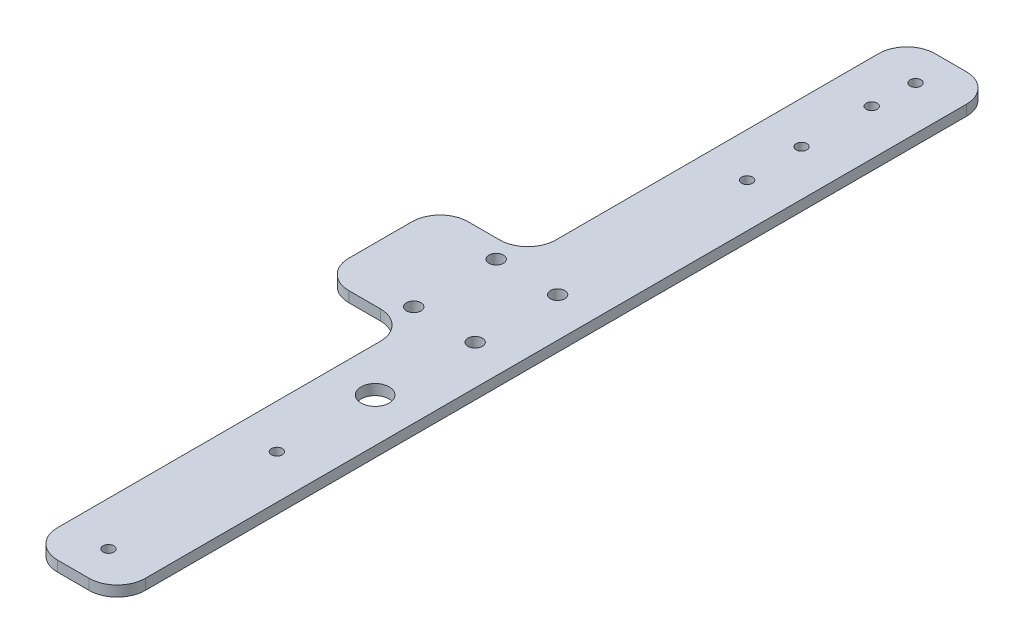
ISO-10303-21;
HEADER;
FILE_DESCRIPTION(('STEP AP214'),'2;1');
FILE_NAME('part.step','',(''),(''),'','','');
FILE_SCHEMA(('AUTOMOTIVE_DESIGN { 1 0 10303 214 1 1 1 1 }'));
ENDSEC;
DATA;
#1=APPLICATION_CONTEXT('core data for automotive mechanical design processes');
#2=APPLICATION_PROTOCOL_DEFINITION('international standard','automotive_design',2000,#1);
#3=PRODUCT_CONTEXT('',#1,'mechanical');
#4=PRODUCT('Part','Part','',(#3));
#5=PRODUCT_RELATED_PRODUCT_CATEGORY('part','',(#4));
#6=PRODUCT_DEFINITION_FORMATION('','',#4);
#7=PRODUCT_DEFINITION_CONTEXT('part definition',#1,'design');
#8=PRODUCT_DEFINITION('design','',#6,#7);
#9=PRODUCT_DEFINITION_SHAPE('','',#8);
#10=(LENGTH_UNIT() NAMED_UNIT(*) SI_UNIT(.MILLI.,.METRE.));
#11=(NAMED_UNIT(*) PLANE_ANGLE_UNIT() SI_UNIT($,.RADIAN.));
#12=(NAMED_UNIT(*) SI_UNIT($,.STERADIAN.) SOLID_ANGLE_UNIT());
#13=UNCERTAINTY_MEASURE_WITH_UNIT(LENGTH_MEASURE(1.E-05),#10,'distance_accuracy_value','');
#14=(GEOMETRIC_REPRESENTATION_CONTEXT(3) GLOBAL_UNCERTAINTY_ASSIGNED_CONTEXT((#13)) GLOBAL_UNIT_ASSIGNED_CONTEXT((#10,
#11,#12)) REPRESENTATION_CONTEXT('',''));
#15=CARTESIAN_POINT('',(0.,0.,0.));
#16=DIRECTION('',(0.,0.,1.));
#17=DIRECTION('',(1.,0.,0.));
#18=AXIS2_PLACEMENT_3D('',#15,#16,#17);
#19=CARTESIAN_POINT('',(-37.5,3.,0.));
#20=DIRECTION('',(1.,0.,0.));
#21=DIRECTION('',(0.,0.,-1.));
#22=AXIS2_PLACEMENT_3D('',#19,#20,#21);
#23=PLANE('',#22);
#24=DIRECTION('',(0.,0.,1.));
#25=VECTOR('',#24,1.);
#26=CARTESIAN_POINT('',(-37.5,0.,0.));
#27=LINE('',#26,#25);
#28=CARTESIAN_POINT('',(-37.5,0.,-9.));
#29=VERTEX_POINT('',#28);
#30=CARTESIAN_POINT('',(-37.5,0.,9.00000000000001));
#31=VERTEX_POINT('',#30);
#32=EDGE_CURVE('E303',#29,#31,#27,.T.);
#33=ORIENTED_EDGE('',*,*,#32,.T.);
#34=DIRECTION('',(0.,-1.,0.));
#35=VECTOR('',#34,1.);
#36=CARTESIAN_POINT('',(-37.5,3.,9.00000000000001));
#37=LINE('',#36,#35);
#38=CARTESIAN_POINT('',(-37.5,3.,9.00000000000001));
#39=VERTEX_POINT('',#38);
#40=EDGE_CURVE('E250',#31,#39,#37,.F.);
#41=ORIENTED_EDGE('',*,*,#40,.T.);
#42=DIRECTION('',(0.,0.,1.));
#43=VECTOR('',#42,1.);
#44=CARTESIAN_POINT('',(-37.5,3.,0.));
#45=LINE('',#44,#43);
#46=CARTESIAN_POINT('',(-37.5,3.,-9.));
#47=VERTEX_POINT('',#46);
#48=EDGE_CURVE('E305',#47,#39,#45,.T.);
#49=ORIENTED_EDGE('',*,*,#48,.F.);
#50=DIRECTION('',(0.,-1.,0.));
#51=VECTOR('',#50,1.);
#52=CARTESIAN_POINT('',(-37.5,0.,-9.));
#53=LINE('',#52,#51);
#54=EDGE_CURVE('E246',#47,#29,#53,.T.);
#55=ORIENTED_EDGE('',*,*,#54,.T.);
#56=EDGE_LOOP('',(#33,#41,#49,#55));
#57=FACE_BOUND('',#56,.T.);
#58=ADVANCED_FACE('F41',(#57),#23,.F.);
#59=CARTESIAN_POINT('',(0.,3.,17.));
#60=DIRECTION('',(0.,0.,-1.));
#61=DIRECTION('',(-1.,0.,0.));
#62=AXIS2_PLACEMENT_3D('',#59,#60,#61);
#63=PLANE('',#62);
#64=DIRECTION('',(1.,0.,0.));
#65=VECTOR('',#64,1.);
#66=CARTESIAN_POINT('',(0.,0.,17.));
#67=LINE('',#66,#65);
#68=CARTESIAN_POINT('',(-29.5,0.,17.));
#69=VERTEX_POINT('',#68);
#70=CARTESIAN_POINT('',(-20.5,0.,17.));
#71=VERTEX_POINT('',#70);
#72=EDGE_CURVE('E308',#69,#71,#67,.T.);
#73=ORIENTED_EDGE('',*,*,#72,.T.);
#74=DIRECTION('',(0.,-1.,0.));
#75=VECTOR('',#74,1.);
#76=CARTESIAN_POINT('',(-20.5,3.,17.));
#77=LINE('',#76,#75);
#78=CARTESIAN_POINT('',(-20.5,3.,17.));
#79=VERTEX_POINT('',#78);
#80=EDGE_CURVE('E243',#71,#79,#77,.F.);
#81=ORIENTED_EDGE('',*,*,#80,.T.);
#82=DIRECTION('',(1.,0.,0.));
#83=VECTOR('',#82,1.);
#84=CARTESIAN_POINT('',(0.,3.,17.));
#85=LINE('',#84,#83);
#86=CARTESIAN_POINT('',(-29.5,3.,17.));
#87=VERTEX_POINT('',#86);
#88=EDGE_CURVE('E331',#87,#79,#85,.T.);
#89=ORIENTED_EDGE('',*,*,#88,.F.);
#90=DIRECTION('',(0.,-1.,0.));
#91=VECTOR('',#90,1.);
#92=CARTESIAN_POINT('',(-29.5,3.,17.));
#93=LINE('',#92,#91);
#94=EDGE_CURVE('E239',#87,#69,#93,.T.);
#95=ORIENTED_EDGE('',*,*,#94,.T.);
#96=EDGE_LOOP('',(#73,#81,#89,#95));
#97=FACE_BOUND('',#96,.T.);
#98=ADVANCED_FACE('F448',(#97),#63,.F.);
#99=CARTESIAN_POINT('',(-12.5,3.,0.));
#100=DIRECTION('',(1.,0.,0.));
#101=DIRECTION('',(0.,0.,-1.));
#102=AXIS2_PLACEMENT_3D('',#99,#100,#101);
#103=PLANE('',#102);
#104=DIRECTION('',(0.,0.,1.));
#105=VECTOR('',#104,1.);
#106=CARTESIAN_POINT('',(-12.5,0.,0.));
#107=LINE('',#106,#105);
#108=CARTESIAN_POINT('',(-12.5,0.,25.));
#109=VERTEX_POINT('',#108);
#110=CARTESIAN_POINT('',(-12.5,0.,117.));
#111=VERTEX_POINT('',#110);
#112=EDGE_CURVE('E314',#109,#111,#107,.T.);
#113=ORIENTED_EDGE('',*,*,#112,.T.);
#114=DIRECTION('',(0.,-1.,0.));
#115=VECTOR('',#114,1.);
#116=CARTESIAN_POINT('',(-12.5,3.,117.));
#117=LINE('',#116,#115);
#118=CARTESIAN_POINT('',(-12.5,3.,117.));
#119=VERTEX_POINT('',#118);
#120=EDGE_CURVE('E236',#111,#119,#117,.F.);
#121=ORIENTED_EDGE('',*,*,#120,.T.);
#122=DIRECTION('',(0.,0.,1.));
#123=VECTOR('',#122,1.);
#124=CARTESIAN_POINT('',(-12.5,3.,0.));
#125=LINE('',#124,#123);
#126=CARTESIAN_POINT('',(-12.5,3.,25.));
#127=VERTEX_POINT('',#126);
#128=EDGE_CURVE('E335',#127,#119,#125,.T.);
#129=ORIENTED_EDGE('',*,*,#128,.F.);
#130=DIRECTION('',(0.,-1.,0.));
#131=VECTOR('',#130,1.);
#132=CARTESIAN_POINT('',(-12.5,0.,25.));
#133=LINE('',#132,#131);
#134=EDGE_CURVE('E232',#127,#109,#133,.T.);
#135=ORIENTED_EDGE('',*,*,#134,.T.);
#136=EDGE_LOOP('',(#113,#121,#129,#135));
#137=FACE_BOUND('',#136,.T.);
#138=ADVANCED_FACE('F453',(#137),#103,.F.);
#139=CARTESIAN_POINT('',(0.,3.,125.));
#140=DIRECTION('',(0.,0.,-1.));
#141=DIRECTION('',(-1.,0.,0.));
#142=AXIS2_PLACEMENT_3D('',#139,#140,#141);
#143=PLANE('',#142);
#144=DIRECTION('',(1.,0.,0.));
#145=VECTOR('',#144,1.);
#146=CARTESIAN_POINT('',(0.,0.,125.));
#147=LINE('',#146,#145);
#148=CARTESIAN_POINT('',(-4.49999999999999,0.,125.));
#149=VERTEX_POINT('',#148);
#150=CARTESIAN_POINT('',(4.50000000000002,0.,125.));
#151=VERTEX_POINT('',#150);
#152=EDGE_CURVE('E178',#149,#151,#147,.T.);
#153=ORIENTED_EDGE('',*,*,#152,.T.);
#154=DIRECTION('',(0.,-1.,0.));
#155=VECTOR('',#154,1.);
#156=CARTESIAN_POINT('',(4.50000000000002,3.,125.));
#157=LINE('',#156,#155);
#158=CARTESIAN_POINT('',(4.50000000000002,3.,125.));
#159=VERTEX_POINT('',#158);
#160=EDGE_CURVE('E212',#151,#159,#157,.F.);
#161=ORIENTED_EDGE('',*,*,#160,.T.);
#162=DIRECTION('',(1.,0.,0.));
#163=VECTOR('',#162,1.);
#164=CARTESIAN_POINT('',(0.,3.,125.));
#165=LINE('',#164,#163);
#166=CARTESIAN_POINT('',(-4.49999999999999,3.,125.));
#167=VERTEX_POINT('',#166);
#168=EDGE_CURVE('E339',#167,#159,#165,.T.);
#169=ORIENTED_EDGE('',*,*,#168,.F.);
#170=DIRECTION('',(0.,-1.,0.));
#171=VECTOR('',#170,1.);
#172=CARTESIAN_POINT('',(-4.49999999999999,3.,125.));
#173=LINE('',#172,#171);
#174=EDGE_CURVE('E208',#167,#149,#173,.T.);
#175=ORIENTED_EDGE('',*,*,#174,.T.);
#176=EDGE_LOOP('',(#153,#161,#169,#175));
#177=FACE_BOUND('',#176,.T.);
#178=ADVANCED_FACE('F681',(#177),#143,.F.);
#179=CARTESIAN_POINT('',(12.5,3.,0.));
#180=DIRECTION('',(1.,0.,0.));
#181=DIRECTION('',(0.,0.,-1.));
#182=AXIS2_PLACEMENT_3D('',#179,#180,#181);
#183=PLANE('',#182);
#184=DIRECTION('',(0.,0.,1.));
#185=VECTOR('',#184,1.);
#186=CARTESIAN_POINT('',(12.5,3.,0.));
#187=LINE('',#186,#185);
#188=CARTESIAN_POINT('',(12.5,3.,-117.));
#189=VERTEX_POINT('',#188);
#190=CARTESIAN_POINT('',(12.5,3.,117.));
#191=VERTEX_POINT('',#190);
#192=EDGE_CURVE('E342',#189,#191,#187,.T.);
#193=ORIENTED_EDGE('',*,*,#192,.T.);
#194=DIRECTION('',(0.,-1.,0.));
#195=VECTOR('',#194,1.);
#196=CARTESIAN_POINT('',(12.5,0.,117.));
#197=LINE('',#196,#195);
#198=CARTESIAN_POINT('',(12.5,0.,117.));
#199=VERTEX_POINT('',#198);
#200=EDGE_CURVE('E176',#191,#199,#197,.T.);
#201=ORIENTED_EDGE('',*,*,#200,.T.);
#202=DIRECTION('',(0.,0.,1.));
#203=VECTOR('',#202,1.);
#204=CARTESIAN_POINT('',(12.5,0.,0.));
#205=LINE('',#204,#203);
#206=CARTESIAN_POINT('',(12.5,0.,-117.));
#207=VERTEX_POINT('',#206);
#208=EDGE_CURVE('E158',#207,#199,#205,.T.);
#209=ORIENTED_EDGE('',*,*,#208,.F.);
#210=DIRECTION('',(0.,-1.,0.));
#211=VECTOR('',#210,1.);
#212=CARTESIAN_POINT('',(12.5,3.,-117.));
#213=LINE('',#212,#211);
#214=EDGE_CURVE('E173',#207,#189,#213,.F.);
#215=ORIENTED_EDGE('',*,*,#214,.T.);
#216=EDGE_LOOP('',(#193,#201,#209,#215));
#217=FACE_BOUND('',#216,.T.);
#218=ADVANCED_FACE('F172',(#217),#183,.T.);
#219=CARTESIAN_POINT('',(0.,3.,-125.));
#220=DIRECTION('',(0.,0.,-1.));
#221=DIRECTION('',(-1.,0.,0.));
#222=AXIS2_PLACEMENT_3D('',#219,#220,#221);
#223=PLANE('',#222);
#224=DIRECTION('',(1.,0.,0.));
#225=VECTOR('',#224,1.);
#226=CARTESIAN_POINT('',(0.,3.,-125.));
#227=LINE('',#226,#225);
#228=CARTESIAN_POINT('',(-4.50000000000001,3.,-125.));
#229=VERTEX_POINT('',#228);
#230=CARTESIAN_POINT('',(4.49999999999999,3.,-125.));
#231=VERTEX_POINT('',#230);
#232=EDGE_CURVE('E345',#229,#231,#227,.T.);
#233=ORIENTED_EDGE('',*,*,#232,.T.);
#234=DIRECTION('',(0.,-1.,0.));
#235=VECTOR('',#234,1.);
#236=CARTESIAN_POINT('',(4.49999999999999,3.,-125.));
#237=LINE('',#236,#235);
#238=CARTESIAN_POINT('',(4.49999999999999,0.,-125.));
#239=VERTEX_POINT('',#238);
#240=EDGE_CURVE('E269',#231,#239,#237,.T.);
#241=ORIENTED_EDGE('',*,*,#240,.T.);
#242=DIRECTION('',(1.,0.,0.));
#243=VECTOR('',#242,1.);
#244=CARTESIAN_POINT('',(0.,0.,-125.));
#245=LINE('',#244,#243);
#246=CARTESIAN_POINT('',(-4.50000000000001,0.,-125.));
#247=VERTEX_POINT('',#246);
#248=EDGE_CURVE('E160',#247,#239,#245,.T.);
#249=ORIENTED_EDGE('',*,*,#248,.F.);
#250=DIRECTION('',(0.,-1.,0.));
#251=VECTOR('',#250,1.);
#252=CARTESIAN_POINT('',(-4.50000000000001,3.,-125.));
#253=LINE('',#252,#251);
#254=EDGE_CURVE('E266',#247,#229,#253,.F.);
#255=ORIENTED_EDGE('',*,*,#254,.T.);
#256=EDGE_LOOP('',(#233,#241,#249,#255));
#257=FACE_BOUND('',#256,.T.);
#258=ADVANCED_FACE('F663',(#257),#223,.T.);
#259=CARTESIAN_POINT('',(-12.5,3.,0.));
#260=DIRECTION('',(1.,0.,0.));
#261=DIRECTION('',(0.,0.,-1.));
#262=AXIS2_PLACEMENT_3D('',#259,#260,#261);
#263=PLANE('',#262);
#264=DIRECTION('',(0.,0.,1.));
#265=VECTOR('',#264,1.);
#266=CARTESIAN_POINT('',(-12.5,0.,0.));
#267=LINE('',#266,#265);
#268=CARTESIAN_POINT('',(-12.5,0.,-117.));
#269=VERTEX_POINT('',#268);
#270=CARTESIAN_POINT('',(-12.5,0.,-25.));
#271=VERTEX_POINT('',#270);
#272=EDGE_CURVE('E281',#269,#271,#267,.T.);
#273=ORIENTED_EDGE('',*,*,#272,.T.);
#274=DIRECTION('',(0.,-1.,0.));
#275=VECTOR('',#274,1.);
#276=CARTESIAN_POINT('',(-12.5,3.,-25.));
#277=LINE('',#276,#275);
#278=CARTESIAN_POINT('',(-12.5,3.,-25.));
#279=VERTEX_POINT('',#278);
#280=EDGE_CURVE('E263',#271,#279,#277,.F.);
#281=ORIENTED_EDGE('',*,*,#280,.T.);
#282=DIRECTION('',(0.,0.,1.));
#283=VECTOR('',#282,1.);
#284=CARTESIAN_POINT('',(-12.5,3.,0.));
#285=LINE('',#284,#283);
#286=CARTESIAN_POINT('',(-12.5,3.,-117.));
#287=VERTEX_POINT('',#286);
#288=EDGE_CURVE('E189',#287,#279,#285,.T.);
#289=ORIENTED_EDGE('',*,*,#288,.F.);
#290=DIRECTION('',(0.,-1.,0.));
#291=VECTOR('',#290,1.);
#292=CARTESIAN_POINT('',(-12.5,0.,-117.));
#293=LINE('',#292,#291);
#294=EDGE_CURVE('E259',#287,#269,#293,.T.);
#295=ORIENTED_EDGE('',*,*,#294,.T.);
#296=EDGE_LOOP('',(#273,#281,#289,#295));
#297=FACE_BOUND('',#296,.T.);
#298=ADVANCED_FACE('F286',(#297),#263,.F.);
#299=CARTESIAN_POINT('',(0.,3.,-17.));
#300=DIRECTION('',(0.,0.,-1.));
#301=DIRECTION('',(-1.,0.,0.));
#302=AXIS2_PLACEMENT_3D('',#299,#300,#301);
#303=PLANE('',#302);
#304=DIRECTION('',(1.,0.,0.));
#305=VECTOR('',#304,1.);
#306=CARTESIAN_POINT('',(0.,0.,-17.));
#307=LINE('',#306,#305);
#308=CARTESIAN_POINT('',(-29.5,0.,-17.));
#309=VERTEX_POINT('',#308);
#310=CARTESIAN_POINT('',(-20.5,0.,-17.));
#311=VERTEX_POINT('',#310);
#312=EDGE_CURVE('E192',#309,#311,#307,.T.);
#313=ORIENTED_EDGE('',*,*,#312,.F.);
#314=DIRECTION('',(0.,-1.,0.));
#315=VECTOR('',#314,1.);
#316=CARTESIAN_POINT('',(-29.5,3.,-17.));
#317=LINE('',#316,#315);
#318=CARTESIAN_POINT('',(-29.5,3.,-17.));
#319=VERTEX_POINT('',#318);
#320=EDGE_CURVE('E62',#309,#319,#317,.F.);
#321=ORIENTED_EDGE('',*,*,#320,.T.);
#322=DIRECTION('',(1.,0.,0.));
#323=VECTOR('',#322,1.);
#324=CARTESIAN_POINT('',(0.,3.,-17.));
#325=LINE('',#324,#323);
#326=CARTESIAN_POINT('',(-20.5,3.,-17.));
#327=VERTEX_POINT('',#326);
#328=EDGE_CURVE('E184',#319,#327,#325,.T.);
#329=ORIENTED_EDGE('',*,*,#328,.T.);
#330=DIRECTION('',(0.,-1.,0.));
#331=VECTOR('',#330,1.);
#332=CARTESIAN_POINT('',(-20.5,3.,-17.));
#333=LINE('',#332,#331);
#334=EDGE_CURVE('E253',#327,#311,#333,.T.);
#335=ORIENTED_EDGE('',*,*,#334,.T.);
#336=EDGE_LOOP('',(#313,#321,#329,#335));
#337=FACE_BOUND('',#336,.T.);
#338=ADVANCED_FACE('F291',(#337),#303,.T.);
#339=CARTESIAN_POINT('',(0.,3.,0.));
#340=DIRECTION('',(0.,1.,0.));
#341=DIRECTION('',(0.,0.,1.));
#342=AXIS2_PLACEMENT_3D('',#339,#340,#341);
#343=PLANE('',#342);
#344=CARTESIAN_POINT('',(0.,3.,39.0000000000001));
#345=DIRECTION('',(0.,1.,0.));
#346=DIRECTION('',(0.,0.,1.));
#347=AXIS2_PLACEMENT_3D('',#344,#345,#346);
#348=CIRCLE('',#347,4.);
#349=CARTESIAN_POINT('',(0.,3.,43.0000000000001));
#350=VERTEX_POINT('',#349);
#351=EDGE_CURVE('E423',#350,#350,#348,.F.);
#352=ORIENTED_EDGE('',*,*,#351,.T.);
#353=EDGE_LOOP('',(#352));
#354=FACE_BOUND('',#353,.T.);
#355=CARTESIAN_POINT('',(-0.500000000000014,3.,-83.));
#356=DIRECTION('',(0.,1.,0.));
#357=DIRECTION('',(0.,0.,1.));
#358=AXIS2_PLACEMENT_3D('',#355,#356,#357);
#359=CIRCLE('',#358,1.55);
#360=CARTESIAN_POINT('',(-0.500000000000014,3.,-81.45));
#361=VERTEX_POINT('',#360);
#362=EDGE_CURVE('E410',#361,#361,#359,.T.);
#363=ORIENTED_EDGE('',*,*,#362,.F.);
#364=EDGE_LOOP('',(#363));
#365=FACE_BOUND('',#364,.T.);
#366=CARTESIAN_POINT('',(-0.500000000000072,3.,-103.));
#367=DIRECTION('',(0.,1.,0.));
#368=DIRECTION('',(0.,0.,1.));
#369=AXIS2_PLACEMENT_3D('',#366,#367,#368);
#370=CIRCLE('',#369,1.54999999999999);
#371=CARTESIAN_POINT('',(-0.500000000000072,3.,-101.45));
#372=VERTEX_POINT('',#371);
#373=EDGE_CURVE('E414',#372,#372,#370,.T.);
#374=ORIENTED_EDGE('',*,*,#373,.F.);
#375=EDGE_LOOP('',(#374));
#376=FACE_BOUND('',#375,.T.);
#377=CARTESIAN_POINT('',(1.25,3.,-11.75));
#378=DIRECTION('',(0.,1.,0.));
#379=DIRECTION('',(0.,0.,1.));
#380=AXIS2_PLACEMENT_3D('',#377,#378,#379);
#381=CIRCLE('',#380,2.04999999999999);
#382=CARTESIAN_POINT('',(1.25,3.,-9.7));
#383=VERTEX_POINT('',#382);
#384=EDGE_CURVE('E309',#383,#383,#381,.T.);
#385=ORIENTED_EDGE('',*,*,#384,.F.);
#386=EDGE_LOOP('',(#385));
#387=FACE_BOUND('',#386,.T.);
#388=CARTESIAN_POINT('',(-16.25,3.,-11.75));
#389=DIRECTION('',(0.,1.,0.));
#390=DIRECTION('',(0.,0.,1.));
#391=AXIS2_PLACEMENT_3D('',#388,#389,#390);
#392=CIRCLE('',#391,2.05000000000001);
#393=CARTESIAN_POINT('',(-16.25,3.,-9.69999999999999));
#394=VERTEX_POINT('',#393);
#395=EDGE_CURVE('E317',#394,#394,#392,.T.);
#396=ORIENTED_EDGE('',*,*,#395,.F.);
#397=EDGE_LOOP('',(#396));
#398=FACE_BOUND('',#397,.T.);
#399=CARTESIAN_POINT('',(-16.25,3.,11.75));
#400=DIRECTION('',(0.,1.,0.));
#401=DIRECTION('',(0.,0.,1.));
#402=AXIS2_PLACEMENT_3D('',#399,#400,#401);
#403=CIRCLE('',#402,2.05000000000001);
#404=CARTESIAN_POINT('',(-16.25,3.,13.8));
#405=VERTEX_POINT('',#404);
#406=EDGE_CURVE('E354',#405,#405,#403,.T.);
#407=ORIENTED_EDGE('',*,*,#406,.F.);
#408=EDGE_LOOP('',(#407));
#409=FACE_BOUND('',#408,.T.);
#410=CARTESIAN_POINT('',(0.,3.,115.));
#411=DIRECTION('',(0.,1.,0.));
#412=DIRECTION('',(0.,0.,1.));
#413=AXIS2_PLACEMENT_3D('',#410,#411,#412);
#414=CIRCLE('',#413,1.55);
#415=CARTESIAN_POINT('',(0.,3.,116.55));
#416=VERTEX_POINT('',#415);
#417=EDGE_CURVE('E358',#416,#416,#414,.T.);
#418=ORIENTED_EDGE('',*,*,#417,.F.);
#419=EDGE_LOOP('',(#418));
#420=FACE_BOUND('',#419,.T.);
#421=CARTESIAN_POINT('',(0.,3.,-67.0000000000001));
#422=DIRECTION('',(0.,1.,0.));
#423=DIRECTION('',(0.,0.,1.));
#424=AXIS2_PLACEMENT_3D('',#421,#422,#423);
#425=CIRCLE('',#424,1.54999999999999);
#426=CARTESIAN_POINT('',(0.,3.,-65.4500000000001));
#427=VERTEX_POINT('',#426);
#428=EDGE_CURVE('E362',#427,#427,#425,.T.);
#429=ORIENTED_EDGE('',*,*,#428,.F.);
#430=EDGE_LOOP('',(#429));
#431=FACE_BOUND('',#430,.T.);
#432=CARTESIAN_POINT('',(0.,3.,-115.));
#433=DIRECTION('',(0.,1.,0.));
#434=DIRECTION('',(0.,0.,1.));
#435=AXIS2_PLACEMENT_3D('',#432,#433,#434);
#436=CIRCLE('',#435,1.55);
#437=CARTESIAN_POINT('',(0.,3.,-113.45));
#438=VERTEX_POINT('',#437);
#439=EDGE_CURVE('E366',#438,#438,#436,.T.);
#440=ORIENTED_EDGE('',*,*,#439,.F.);
#441=EDGE_LOOP('',(#440));
#442=FACE_BOUND('',#441,.T.);
#443=CARTESIAN_POINT('',(0.,3.,67.0000000000001));
#444=DIRECTION('',(0.,1.,0.));
#445=DIRECTION('',(0.,0.,1.));
#446=AXIS2_PLACEMENT_3D('',#443,#444,#445);
#447=CIRCLE('',#446,1.54999999999999);
#448=CARTESIAN_POINT('',(0.,3.,68.5500000000001));
#449=VERTEX_POINT('',#448);
#450=EDGE_CURVE('E370',#449,#449,#447,.T.);
#451=ORIENTED_EDGE('',*,*,#450,.F.);
#452=EDGE_LOOP('',(#451));
#453=FACE_BOUND('',#452,.T.);
#454=CARTESIAN_POINT('',(1.25,3.,11.75));
#455=DIRECTION('',(0.,1.,0.));
#456=DIRECTION('',(0.,0.,1.));
#457=AXIS2_PLACEMENT_3D('',#454,#455,#456);
#458=CIRCLE('',#457,2.04999999999999);
#459=CARTESIAN_POINT('',(1.25,3.,13.8));
#460=VERTEX_POINT('',#459);
#461=EDGE_CURVE('E374',#460,#460,#458,.T.);
#462=ORIENTED_EDGE('',*,*,#461,.F.);
#463=EDGE_LOOP('',(#462));
#464=FACE_BOUND('',#463,.T.);
#465=ORIENTED_EDGE('',*,*,#168,.T.);
#466=CARTESIAN_POINT('',(4.50000000000002,3.,117.));
#467=DIRECTION('',(0.,1.,0.));
#468=DIRECTION('',(0.,0.,1.));
#469=AXIS2_PLACEMENT_3D('',#466,#467,#468);
#470=CIRCLE('',#469,8.);
#471=EDGE_CURVE('E229',#159,#191,#470,.T.);
#472=ORIENTED_EDGE('',*,*,#471,.T.);
#473=ORIENTED_EDGE('',*,*,#192,.F.);
#474=CARTESIAN_POINT('',(4.49999999999999,3.,-117.));
#475=DIRECTION('',(0.,1.,0.));
#476=DIRECTION('',(0.,0.,1.));
#477=AXIS2_PLACEMENT_3D('',#474,#475,#476);
#478=CIRCLE('',#477,8.);
#479=EDGE_CURVE('E182',#189,#231,#478,.T.);
#480=ORIENTED_EDGE('',*,*,#479,.T.);
#481=ORIENTED_EDGE('',*,*,#232,.F.);
#482=CARTESIAN_POINT('',(-4.50000000000001,3.,-117.));
#483=DIRECTION('',(0.,1.,0.));
#484=DIRECTION('',(0.,0.,1.));
#485=AXIS2_PLACEMENT_3D('',#482,#483,#484);
#486=CIRCLE('',#485,8.);
#487=EDGE_CURVE('E215',#229,#287,#486,.T.);
#488=ORIENTED_EDGE('',*,*,#487,.T.);
#489=ORIENTED_EDGE('',*,*,#288,.T.);
#490=CARTESIAN_POINT('',(-20.5,3.,-25.));
#491=DIRECTION('',(0.,1.,0.));
#492=DIRECTION('',(0.,0.,1.));
#493=AXIS2_PLACEMENT_3D('',#490,#491,#492);
#494=CIRCLE('',#493,8.);
#495=EDGE_CURVE('E11',#279,#327,#494,.F.);
#496=ORIENTED_EDGE('',*,*,#495,.T.);
#497=ORIENTED_EDGE('',*,*,#328,.F.);
#498=CARTESIAN_POINT('',(-29.5,3.,-9.));
#499=DIRECTION('',(0.,1.,0.));
#500=DIRECTION('',(0.,0.,1.));
#501=AXIS2_PLACEMENT_3D('',#498,#499,#500);
#502=CIRCLE('',#501,8.);
#503=EDGE_CURVE('E220',#319,#47,#502,.T.);
#504=ORIENTED_EDGE('',*,*,#503,.T.);
#505=ORIENTED_EDGE('',*,*,#48,.T.);
#506=CARTESIAN_POINT('',(-29.5,3.,9.00000000000001));
#507=DIRECTION('',(0.,1.,0.));
#508=DIRECTION('',(0.,0.,1.));
#509=AXIS2_PLACEMENT_3D('',#506,#507,#508);
#510=CIRCLE('',#509,8.);
#511=EDGE_CURVE('E223',#39,#87,#510,.T.);
#512=ORIENTED_EDGE('',*,*,#511,.T.);
#513=ORIENTED_EDGE('',*,*,#88,.T.);
#514=CARTESIAN_POINT('',(-20.5,3.,25.));
#515=DIRECTION('',(0.,1.,0.));
#516=DIRECTION('',(0.,0.,1.));
#517=AXIS2_PLACEMENT_3D('',#514,#515,#516);
#518=CIRCLE('',#517,8.);
#519=EDGE_CURVE('E275',#79,#127,#518,.F.);
#520=ORIENTED_EDGE('',*,*,#519,.T.);
#521=ORIENTED_EDGE('',*,*,#128,.T.);
#522=CARTESIAN_POINT('',(-4.49999999999999,3.,117.));
#523=DIRECTION('',(0.,1.,0.));
#524=DIRECTION('',(0.,0.,1.));
#525=AXIS2_PLACEMENT_3D('',#522,#523,#524);
#526=CIRCLE('',#525,8.);
#527=EDGE_CURVE('E226',#119,#167,#526,.T.);
#528=ORIENTED_EDGE('',*,*,#527,.T.);
#529=EDGE_LOOP('',(#465,#472,#473,#480,#481,#488,#489,#496,#497,#504,#505,#512,#513,#520,#521,#528));
#530=FACE_BOUND('',#529,.T.);
#531=ADVANCED_FACE('F294',(#354,#365,#376,#387,#398,#409,#420,#431,#442,#453,#464,#530),#343,.T.);
#532=CARTESIAN_POINT('',(0.,0.,0.));
#533=DIRECTION('',(0.,1.,0.));
#534=DIRECTION('',(0.,0.,1.));
#535=AXIS2_PLACEMENT_3D('',#532,#533,#534);
#536=PLANE('',#535);
#537=CARTESIAN_POINT('',(0.,0.,39.0000000000001));
#538=DIRECTION('',(0.,1.,0.));
#539=DIRECTION('',(0.,0.,1.));
#540=AXIS2_PLACEMENT_3D('',#537,#538,#539);
#541=CIRCLE('',#540,4.);
#542=CARTESIAN_POINT('',(0.,0.,43.0000000000001));
#543=VERTEX_POINT('',#542);
#544=EDGE_CURVE('E430',#543,#543,#541,.T.);
#545=ORIENTED_EDGE('',*,*,#544,.T.);
#546=EDGE_LOOP('',(#545));
#547=FACE_BOUND('',#546,.T.);
#548=CARTESIAN_POINT('',(-0.500000000000014,0.,-83.));
#549=DIRECTION('',(0.,-1.,0.));
#550=DIRECTION('',(0.,0.,-1.));
#551=AXIS2_PLACEMENT_3D('',#548,#549,#550);
#552=CIRCLE('',#551,1.55);
#553=CARTESIAN_POINT('',(-0.500000000000014,0.,-84.55));
#554=VERTEX_POINT('',#553);
#555=EDGE_CURVE('E418',#554,#554,#552,.T.);
#556=ORIENTED_EDGE('',*,*,#555,.F.);
#557=EDGE_LOOP('',(#556));
#558=FACE_BOUND('',#557,.T.);
#559=CARTESIAN_POINT('',(-0.500000000000072,0.,-103.));
#560=DIRECTION('',(0.,-1.,0.));
#561=DIRECTION('',(0.,0.,-1.));
#562=AXIS2_PLACEMENT_3D('',#559,#560,#561);
#563=CIRCLE('',#562,1.54999999999999);
#564=CARTESIAN_POINT('',(-0.500000000000072,0.,-104.55));
#565=VERTEX_POINT('',#564);
#566=EDGE_CURVE('E419',#565,#565,#563,.T.);
#567=ORIENTED_EDGE('',*,*,#566,.F.);
#568=EDGE_LOOP('',(#567));
#569=FACE_BOUND('',#568,.T.);
#570=CARTESIAN_POINT('',(1.25,0.,-11.75));
#571=DIRECTION('',(0.,-1.,0.));
#572=DIRECTION('',(0.,0.,-1.));
#573=AXIS2_PLACEMENT_3D('',#570,#571,#572);
#574=CIRCLE('',#573,2.04999999999999);
#575=CARTESIAN_POINT('',(1.25,0.,-13.8));
#576=VERTEX_POINT('',#575);
#577=EDGE_CURVE('E382',#576,#576,#574,.T.);
#578=ORIENTED_EDGE('',*,*,#577,.F.);
#579=EDGE_LOOP('',(#578));
#580=FACE_BOUND('',#579,.T.);
#581=CARTESIAN_POINT('',(-16.25,0.,-11.75));
#582=DIRECTION('',(0.,-1.,0.));
#583=DIRECTION('',(0.,0.,-1.));
#584=AXIS2_PLACEMENT_3D('',#581,#582,#583);
#585=CIRCLE('',#584,2.05000000000001);
#586=CARTESIAN_POINT('',(-16.25,0.,-13.8));
#587=VERTEX_POINT('',#586);
#588=EDGE_CURVE('E392',#587,#587,#585,.T.);
#589=ORIENTED_EDGE('',*,*,#588,.F.);
#590=EDGE_LOOP('',(#589));
#591=FACE_BOUND('',#590,.T.);
#592=CARTESIAN_POINT('',(-16.25,0.,11.75));
#593=DIRECTION('',(0.,-1.,0.));
#594=DIRECTION('',(0.,0.,-1.));
#595=AXIS2_PLACEMENT_3D('',#592,#593,#594);
#596=CIRCLE('',#595,2.05000000000001);
#597=CARTESIAN_POINT('',(-16.25,0.,9.69999999999999));
#598=VERTEX_POINT('',#597);
#599=EDGE_CURVE('E387',#598,#598,#596,.T.);
#600=ORIENTED_EDGE('',*,*,#599,.F.);
#601=EDGE_LOOP('',(#600));
#602=FACE_BOUND('',#601,.T.);
#603=CARTESIAN_POINT('',(0.,0.,115.));
#604=DIRECTION('',(0.,-1.,0.));
#605=DIRECTION('',(0.,0.,-1.));
#606=AXIS2_PLACEMENT_3D('',#603,#604,#605);
#607=CIRCLE('',#606,1.55);
#608=CARTESIAN_POINT('',(0.,0.,113.45));
#609=VERTEX_POINT('',#608);
#610=EDGE_CURVE('E383',#609,#609,#607,.T.);
#611=ORIENTED_EDGE('',*,*,#610,.F.);
#612=EDGE_LOOP('',(#611));
#613=FACE_BOUND('',#612,.T.);
#614=CARTESIAN_POINT('',(0.,0.,-67.0000000000001));
#615=DIRECTION('',(0.,-1.,0.));
#616=DIRECTION('',(0.,0.,1.));
#617=AXIS2_PLACEMENT_3D('',#614,#615,#616);
#618=CIRCLE('',#617,1.54999999999999);
#619=CARTESIAN_POINT('',(0.,0.,-65.4500000000001));
#620=VERTEX_POINT('',#619);
#621=EDGE_CURVE('E403',#620,#620,#618,.T.);
#622=ORIENTED_EDGE('',*,*,#621,.F.);
#623=EDGE_LOOP('',(#622));
#624=FACE_BOUND('',#623,.T.);
#625=CARTESIAN_POINT('',(0.,0.,-115.));
#626=DIRECTION('',(0.,-1.,0.));
#627=DIRECTION('',(0.,0.,1.));
#628=AXIS2_PLACEMENT_3D('',#625,#626,#627);
#629=CIRCLE('',#628,1.55);
#630=CARTESIAN_POINT('',(0.,0.,-113.45));
#631=VERTEX_POINT('',#630);
#632=EDGE_CURVE('E399',#631,#631,#629,.T.);
#633=ORIENTED_EDGE('',*,*,#632,.F.);
#634=EDGE_LOOP('',(#633));
#635=FACE_BOUND('',#634,.T.);
#636=CARTESIAN_POINT('',(0.,0.,67.0000000000001));
#637=DIRECTION('',(0.,-1.,0.));
#638=DIRECTION('',(0.,0.,-1.));
#639=AXIS2_PLACEMENT_3D('',#636,#637,#638);
#640=CIRCLE('',#639,1.54999999999999);
#641=CARTESIAN_POINT('',(0.,0.,65.4500000000001));
#642=VERTEX_POINT('',#641);
#643=EDGE_CURVE('E388',#642,#642,#640,.T.);
#644=ORIENTED_EDGE('',*,*,#643,.F.);
#645=EDGE_LOOP('',(#644));
#646=FACE_BOUND('',#645,.T.);
#647=CARTESIAN_POINT('',(1.25,0.,11.75));
#648=DIRECTION('',(0.,-1.,0.));
#649=DIRECTION('',(0.,0.,-1.));
#650=AXIS2_PLACEMENT_3D('',#647,#648,#649);
#651=CIRCLE('',#650,2.04999999999999);
#652=CARTESIAN_POINT('',(1.25,0.,9.70000000000001));
#653=VERTEX_POINT('',#652);
#654=EDGE_CURVE('E378',#653,#653,#651,.T.);
#655=ORIENTED_EDGE('',*,*,#654,.F.);
#656=EDGE_LOOP('',(#655));
#657=FACE_BOUND('',#656,.T.);
#658=ORIENTED_EDGE('',*,*,#208,.T.);
#659=CARTESIAN_POINT('',(4.50000000000002,0.,117.));
#660=DIRECTION('',(0.,1.,0.));
#661=DIRECTION('',(0.,0.,1.));
#662=AXIS2_PLACEMENT_3D('',#659,#660,#661);
#663=CIRCLE('',#662,8.);
#664=EDGE_CURVE('E205',#199,#151,#663,.F.);
#665=ORIENTED_EDGE('',*,*,#664,.T.);
#666=ORIENTED_EDGE('',*,*,#152,.F.);
#667=CARTESIAN_POINT('',(-4.49999999999999,0.,117.));
#668=DIRECTION('',(0.,1.,0.));
#669=DIRECTION('',(0.,0.,1.));
#670=AXIS2_PLACEMENT_3D('',#667,#668,#669);
#671=CIRCLE('',#670,8.);
#672=EDGE_CURVE('E202',#149,#111,#671,.F.);
#673=ORIENTED_EDGE('',*,*,#672,.T.);
#674=ORIENTED_EDGE('',*,*,#112,.F.);
#675=CARTESIAN_POINT('',(-20.5,0.,25.));
#676=DIRECTION('',(0.,1.,0.));
#677=DIRECTION('',(0.,0.,1.));
#678=AXIS2_PLACEMENT_3D('',#675,#676,#677);
#679=CIRCLE('',#678,8.);
#680=EDGE_CURVE('E272',#109,#71,#679,.T.);
#681=ORIENTED_EDGE('',*,*,#680,.T.);
#682=ORIENTED_EDGE('',*,*,#72,.F.);
#683=CARTESIAN_POINT('',(-29.5,0.,9.00000000000001));
#684=DIRECTION('',(0.,1.,0.));
#685=DIRECTION('',(0.,0.,1.));
#686=AXIS2_PLACEMENT_3D('',#683,#684,#685);
#687=CIRCLE('',#686,8.);
#688=EDGE_CURVE('E199',#69,#31,#687,.F.);
#689=ORIENTED_EDGE('',*,*,#688,.T.);
#690=ORIENTED_EDGE('',*,*,#32,.F.);
#691=CARTESIAN_POINT('',(-29.5,0.,-9.));
#692=DIRECTION('',(0.,1.,0.));
#693=DIRECTION('',(0.,0.,1.));
#694=AXIS2_PLACEMENT_3D('',#691,#692,#693);
#695=CIRCLE('',#694,8.);
#696=EDGE_CURVE('E166',#29,#309,#695,.F.);
#697=ORIENTED_EDGE('',*,*,#696,.T.);
#698=ORIENTED_EDGE('',*,*,#312,.T.);
#699=CARTESIAN_POINT('',(-20.5,0.,-25.));
#700=DIRECTION('',(0.,1.,0.));
#701=DIRECTION('',(0.,0.,1.));
#702=AXIS2_PLACEMENT_3D('',#699,#700,#701);
#703=CIRCLE('',#702,8.);
#704=EDGE_CURVE('E50',#311,#271,#703,.T.);
#705=ORIENTED_EDGE('',*,*,#704,.T.);
#706=ORIENTED_EDGE('',*,*,#272,.F.);
#707=CARTESIAN_POINT('',(-4.50000000000001,0.,-117.));
#708=DIRECTION('',(0.,1.,0.));
#709=DIRECTION('',(0.,0.,1.));
#710=AXIS2_PLACEMENT_3D('',#707,#708,#709);
#711=CIRCLE('',#710,8.);
#712=EDGE_CURVE('E167',#269,#247,#711,.F.);
#713=ORIENTED_EDGE('',*,*,#712,.T.);
#714=ORIENTED_EDGE('',*,*,#248,.T.);
#715=CARTESIAN_POINT('',(4.49999999999999,0.,-117.));
#716=DIRECTION('',(0.,1.,0.));
#717=DIRECTION('',(0.,0.,1.));
#718=AXIS2_PLACEMENT_3D('',#715,#716,#717);
#719=CIRCLE('',#718,8.);
#720=EDGE_CURVE('E155',#239,#207,#719,.F.);
#721=ORIENTED_EDGE('',*,*,#720,.T.);
#722=EDGE_LOOP('',(#658,#665,#666,#673,#674,#681,#682,#689,#690,#697,#698,#705,#706,#713,#714,#721));
#723=FACE_BOUND('',#722,.T.);
#724=ADVANCED_FACE('F157',(#547,#558,#569,#580,#591,#602,#613,#624,#635,#646,#657,#723),#536,.F.);
#725=CARTESIAN_POINT('',(1.25,10.,11.75));
#726=DIRECTION('',(0.,-1.,0.));
#727=DIRECTION('',(0.,0.,-1.));
#728=AXIS2_PLACEMENT_3D('',#725,#726,#727);
#729=CYLINDRICAL_SURFACE('',#728,2.04999999999999);
#730=ORIENTED_EDGE('',*,*,#461,.T.);
#731=EDGE_LOOP('',(#730));
#732=FACE_BOUND('',#731,.T.);
#733=ORIENTED_EDGE('',*,*,#654,.T.);
#734=EDGE_LOOP('',(#733));
#735=FACE_BOUND('',#734,.T.);
#736=ADVANCED_FACE('F508',(#732,#735),#729,.F.);
#737=CARTESIAN_POINT('',(0.,10.,67.0000000000001));
#738=DIRECTION('',(0.,-1.,0.));
#739=DIRECTION('',(0.,0.,-1.));
#740=AXIS2_PLACEMENT_3D('',#737,#738,#739);
#741=CYLINDRICAL_SURFACE('',#740,1.54999999999999);
#742=ORIENTED_EDGE('',*,*,#450,.T.);
#743=EDGE_LOOP('',(#742));
#744=FACE_BOUND('',#743,.T.);
#745=ORIENTED_EDGE('',*,*,#643,.T.);
#746=EDGE_LOOP('',(#745));
#747=FACE_BOUND('',#746,.T.);
#748=ADVANCED_FACE('F522',(#744,#747),#741,.F.);
#749=CARTESIAN_POINT('',(0.,10.,-115.));
#750=DIRECTION('',(0.,-1.,0.));
#751=DIRECTION('',(0.,0.,-1.));
#752=AXIS2_PLACEMENT_3D('',#749,#750,#751);
#753=CYLINDRICAL_SURFACE('',#752,1.55);
#754=ORIENTED_EDGE('',*,*,#439,.T.);
#755=EDGE_LOOP('',(#754));
#756=FACE_BOUND('',#755,.T.);
#757=ORIENTED_EDGE('',*,*,#632,.T.);
#758=EDGE_LOOP('',(#757));
#759=FACE_BOUND('',#758,.T.);
#760=ADVANCED_FACE('F529',(#756,#759),#753,.F.);
#761=CARTESIAN_POINT('',(0.,10.,-67.0000000000001));
#762=DIRECTION('',(0.,-1.,0.));
#763=DIRECTION('',(0.,0.,-1.));
#764=AXIS2_PLACEMENT_3D('',#761,#762,#763);
#765=CYLINDRICAL_SURFACE('',#764,1.54999999999999);
#766=ORIENTED_EDGE('',*,*,#428,.T.);
#767=EDGE_LOOP('',(#766));
#768=FACE_BOUND('',#767,.T.);
#769=ORIENTED_EDGE('',*,*,#621,.T.);
#770=EDGE_LOOP('',(#769));
#771=FACE_BOUND('',#770,.T.);
#772=ADVANCED_FACE('F537',(#768,#771),#765,.F.);
#773=CARTESIAN_POINT('',(0.,10.,115.));
#774=DIRECTION('',(0.,-1.,0.));
#775=DIRECTION('',(0.,0.,-1.));
#776=AXIS2_PLACEMENT_3D('',#773,#774,#775);
#777=CYLINDRICAL_SURFACE('',#776,1.55);
#778=ORIENTED_EDGE('',*,*,#417,.T.);
#779=EDGE_LOOP('',(#778));
#780=FACE_BOUND('',#779,.T.);
#781=ORIENTED_EDGE('',*,*,#610,.T.);
#782=EDGE_LOOP('',(#781));
#783=FACE_BOUND('',#782,.T.);
#784=ADVANCED_FACE('F545',(#780,#783),#777,.F.);
#785=CARTESIAN_POINT('',(-16.25,10.,11.75));
#786=DIRECTION('',(0.,-1.,0.));
#787=DIRECTION('',(0.,0.,-1.));
#788=AXIS2_PLACEMENT_3D('',#785,#786,#787);
#789=CYLINDRICAL_SURFACE('',#788,2.05000000000001);
#790=ORIENTED_EDGE('',*,*,#406,.T.);
#791=EDGE_LOOP('',(#790));
#792=FACE_BOUND('',#791,.T.);
#793=ORIENTED_EDGE('',*,*,#599,.T.);
#794=EDGE_LOOP('',(#793));
#795=FACE_BOUND('',#794,.T.);
#796=ADVANCED_FACE('F553',(#792,#795),#789,.F.);
#797=CARTESIAN_POINT('',(-16.25,10.,-11.75));
#798=DIRECTION('',(0.,-1.,0.));
#799=DIRECTION('',(0.,0.,-1.));
#800=AXIS2_PLACEMENT_3D('',#797,#798,#799);
#801=CYLINDRICAL_SURFACE('',#800,2.05000000000001);
#802=ORIENTED_EDGE('',*,*,#395,.T.);
#803=EDGE_LOOP('',(#802));
#804=FACE_BOUND('',#803,.T.);
#805=ORIENTED_EDGE('',*,*,#588,.T.);
#806=EDGE_LOOP('',(#805));
#807=FACE_BOUND('',#806,.T.);
#808=ADVANCED_FACE('F561',(#804,#807),#801,.F.);
#809=CARTESIAN_POINT('',(1.25,10.,-11.75));
#810=DIRECTION('',(0.,-1.,0.));
#811=DIRECTION('',(0.,0.,-1.));
#812=AXIS2_PLACEMENT_3D('',#809,#810,#811);
#813=CYLINDRICAL_SURFACE('',#812,2.04999999999999);
#814=ORIENTED_EDGE('',*,*,#384,.T.);
#815=EDGE_LOOP('',(#814));
#816=FACE_BOUND('',#815,.T.);
#817=ORIENTED_EDGE('',*,*,#577,.T.);
#818=EDGE_LOOP('',(#817));
#819=FACE_BOUND('',#818,.T.);
#820=ADVANCED_FACE('F569',(#816,#819),#813,.F.);
#821=CARTESIAN_POINT('',(-0.500000000000072,10.,-103.));
#822=DIRECTION('',(0.,-1.,0.));
#823=DIRECTION('',(0.,0.,-1.));
#824=AXIS2_PLACEMENT_3D('',#821,#822,#823);
#825=CYLINDRICAL_SURFACE('',#824,1.54999999999999);
#826=ORIENTED_EDGE('',*,*,#373,.T.);
#827=EDGE_LOOP('',(#826));
#828=FACE_BOUND('',#827,.T.);
#829=ORIENTED_EDGE('',*,*,#566,.T.);
#830=EDGE_LOOP('',(#829));
#831=FACE_BOUND('',#830,.T.);
#832=ADVANCED_FACE('F577',(#828,#831),#825,.F.);
#833=CARTESIAN_POINT('',(-0.500000000000014,10.,-83.));
#834=DIRECTION('',(0.,-1.,0.));
#835=DIRECTION('',(0.,0.,-1.));
#836=AXIS2_PLACEMENT_3D('',#833,#834,#835);
#837=CYLINDRICAL_SURFACE('',#836,1.55);
#838=ORIENTED_EDGE('',*,*,#362,.T.);
#839=EDGE_LOOP('',(#838));
#840=FACE_BOUND('',#839,.T.);
#841=ORIENTED_EDGE('',*,*,#555,.T.);
#842=EDGE_LOOP('',(#841));
#843=FACE_BOUND('',#842,.T.);
#844=ADVANCED_FACE('F462',(#840,#843),#837,.F.);
#845=CARTESIAN_POINT('',(4.50000000000002,3.,117.));
#846=DIRECTION('',(0.,1.,0.));
#847=DIRECTION('',(0.,0.,1.));
#848=AXIS2_PLACEMENT_3D('',#845,#846,#847);
#849=CYLINDRICAL_SURFACE('',#848,8.);
#850=ORIENTED_EDGE('',*,*,#471,.F.);
#851=ORIENTED_EDGE('',*,*,#160,.F.);
#852=ORIENTED_EDGE('',*,*,#664,.F.);
#853=ORIENTED_EDGE('',*,*,#200,.F.);
#854=EDGE_LOOP('',(#850,#851,#852,#853));
#855=FACE_BOUND('',#854,.T.);
#856=ADVANCED_FACE('F458',(#855),#849,.T.);
#857=CARTESIAN_POINT('',(-4.49999999999999,3.,117.));
#858=DIRECTION('',(0.,-1.,0.));
#859=DIRECTION('',(0.,0.,-1.));
#860=AXIS2_PLACEMENT_3D('',#857,#858,#859);
#861=CYLINDRICAL_SURFACE('',#860,8.);
#862=ORIENTED_EDGE('',*,*,#527,.F.);
#863=ORIENTED_EDGE('',*,*,#120,.F.);
#864=ORIENTED_EDGE('',*,*,#672,.F.);
#865=ORIENTED_EDGE('',*,*,#174,.F.);
#866=EDGE_LOOP('',(#862,#863,#864,#865));
#867=FACE_BOUND('',#866,.T.);
#868=ADVANCED_FACE('F461',(#867),#861,.T.);
#869=CARTESIAN_POINT('',(-20.5,3.,25.));
#870=DIRECTION('',(0.,1.,0.));
#871=DIRECTION('',(0.,0.,1.));
#872=AXIS2_PLACEMENT_3D('',#869,#870,#871);
#873=CYLINDRICAL_SURFACE('',#872,8.);
#874=ORIENTED_EDGE('',*,*,#519,.F.);
#875=ORIENTED_EDGE('',*,*,#80,.F.);
#876=ORIENTED_EDGE('',*,*,#680,.F.);
#877=ORIENTED_EDGE('',*,*,#134,.F.);
#878=EDGE_LOOP('',(#874,#875,#876,#877));
#879=FACE_BOUND('',#878,.T.);
#880=ADVANCED_FACE('F466',(#879),#873,.F.);
#881=CARTESIAN_POINT('',(-29.5,3.,9.00000000000001));
#882=DIRECTION('',(0.,-1.,0.));
#883=DIRECTION('',(0.,0.,-1.));
#884=AXIS2_PLACEMENT_3D('',#881,#882,#883);
#885=CYLINDRICAL_SURFACE('',#884,8.);
#886=ORIENTED_EDGE('',*,*,#511,.F.);
#887=ORIENTED_EDGE('',*,*,#40,.F.);
#888=ORIENTED_EDGE('',*,*,#688,.F.);
#889=ORIENTED_EDGE('',*,*,#94,.F.);
#890=EDGE_LOOP('',(#886,#887,#888,#889));
#891=FACE_BOUND('',#890,.T.);
#892=ADVANCED_FACE('F470',(#891),#885,.T.);
#893=CARTESIAN_POINT('',(-29.5,3.,-9.));
#894=DIRECTION('',(0.,1.,0.));
#895=DIRECTION('',(0.,0.,1.));
#896=AXIS2_PLACEMENT_3D('',#893,#894,#895);
#897=CYLINDRICAL_SURFACE('',#896,8.);
#898=ORIENTED_EDGE('',*,*,#503,.F.);
#899=ORIENTED_EDGE('',*,*,#320,.F.);
#900=ORIENTED_EDGE('',*,*,#696,.F.);
#901=ORIENTED_EDGE('',*,*,#54,.F.);
#902=EDGE_LOOP('',(#898,#899,#900,#901));
#903=FACE_BOUND('',#902,.T.);
#904=ADVANCED_FACE('F299',(#903),#897,.T.);
#905=CARTESIAN_POINT('',(-20.5,3.,-25.));
#906=DIRECTION('',(0.,-1.,0.));
#907=DIRECTION('',(0.,0.,-1.));
#908=AXIS2_PLACEMENT_3D('',#905,#906,#907);
#909=CYLINDRICAL_SURFACE('',#908,8.);
#910=ORIENTED_EDGE('',*,*,#495,.F.);
#911=ORIENTED_EDGE('',*,*,#280,.F.);
#912=ORIENTED_EDGE('',*,*,#704,.F.);
#913=ORIENTED_EDGE('',*,*,#334,.F.);
#914=EDGE_LOOP('',(#910,#911,#912,#913));
#915=FACE_BOUND('',#914,.T.);
#916=ADVANCED_FACE('F290',(#915),#909,.F.);
#917=CARTESIAN_POINT('',(4.49999999999999,3.,-117.));
#918=DIRECTION('',(0.,-1.,0.));
#919=DIRECTION('',(0.,0.,-1.));
#920=AXIS2_PLACEMENT_3D('',#917,#918,#919);
#921=CYLINDRICAL_SURFACE('',#920,8.);
#922=ORIENTED_EDGE('',*,*,#479,.F.);
#923=ORIENTED_EDGE('',*,*,#214,.F.);
#924=ORIENTED_EDGE('',*,*,#720,.F.);
#925=ORIENTED_EDGE('',*,*,#240,.F.);
#926=EDGE_LOOP('',(#922,#923,#924,#925));
#927=FACE_BOUND('',#926,.T.);
#928=ADVANCED_FACE('F181',(#927),#921,.T.);
#929=CARTESIAN_POINT('',(-4.50000000000001,3.,-117.));
#930=DIRECTION('',(0.,1.,0.));
#931=DIRECTION('',(0.,0.,1.));
#932=AXIS2_PLACEMENT_3D('',#929,#930,#931);
#933=CYLINDRICAL_SURFACE('',#932,8.);
#934=ORIENTED_EDGE('',*,*,#487,.F.);
#935=ORIENTED_EDGE('',*,*,#254,.F.);
#936=ORIENTED_EDGE('',*,*,#712,.F.);
#937=ORIENTED_EDGE('',*,*,#294,.F.);
#938=EDGE_LOOP('',(#934,#935,#936,#937));
#939=FACE_BOUND('',#938,.T.);
#940=ADVANCED_FACE('F43',(#939),#933,.T.);
#941=CARTESIAN_POINT('',(0.,10.,39.0000000000001));
#942=DIRECTION('',(0.,-1.,0.));
#943=DIRECTION('',(0.,0.,-1.));
#944=AXIS2_PLACEMENT_3D('',#941,#942,#943);
#945=CYLINDRICAL_SURFACE('',#944,4.);
#946=ORIENTED_EDGE('',*,*,#351,.F.);
#947=EDGE_LOOP('',(#946));
#948=FACE_BOUND('',#947,.T.);
#949=ORIENTED_EDGE('',*,*,#544,.F.);
#950=EDGE_LOOP('',(#949));
#951=FACE_BOUND('',#950,.T.);
#952=ADVANCED_FACE('F437',(#948,#951),#945,.F.);
#953=CLOSED_SHELL('',(#58,#98,#138,#178,#218,#258,#298,#338,#531,#724,#736,#748,#760,#772,#784,
#796,#808,#820,#832,#844,#856,#868,#880,#892,#904,#916,#928,#940,#952));
#954=MANIFOLD_SOLID_BREP('B2',#953);
#955=ADVANCED_BREP_SHAPE_REPRESENTATION('',(#18,#954),#14);
#956=SHAPE_DEFINITION_REPRESENTATION(#9,#955);
ENDSEC;
END-ISO-10303-21;
